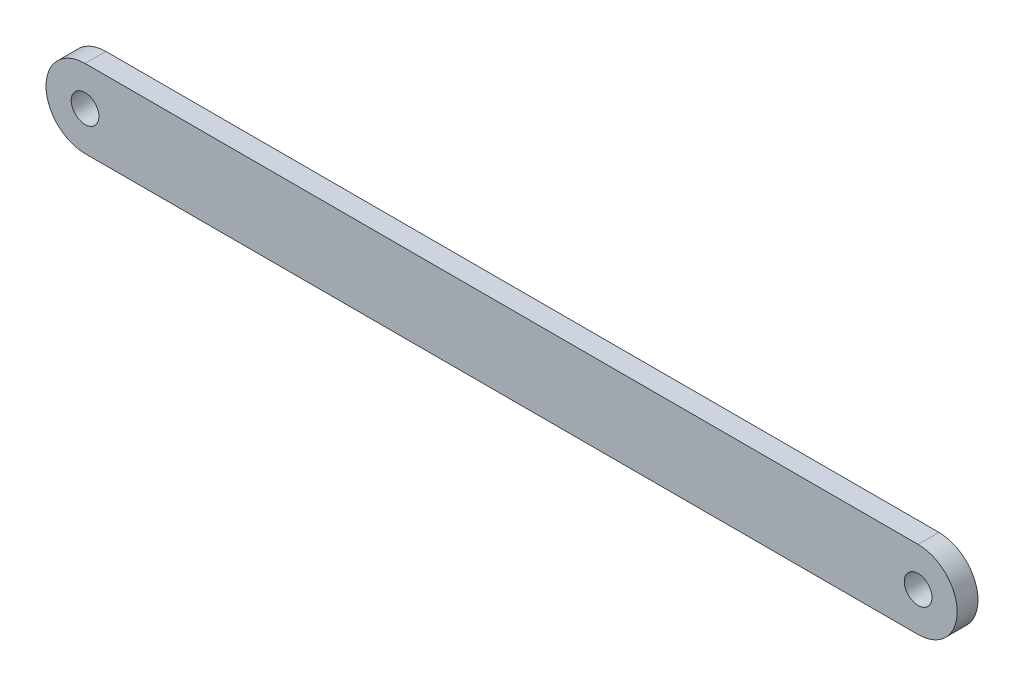
ISO-10303-21;
HEADER;
FILE_DESCRIPTION(('STEP AP214'),'2;1');
FILE_NAME('part.step','',(''),(''),'','','');
FILE_SCHEMA(('AUTOMOTIVE_DESIGN { 1 0 10303 214 1 1 1 1 }'));
ENDSEC;
DATA;
#1=APPLICATION_CONTEXT('core data for automotive mechanical design processes');
#2=APPLICATION_PROTOCOL_DEFINITION('international standard','automotive_design',2000,#1);
#3=PRODUCT_CONTEXT('',#1,'mechanical');
#4=PRODUCT('Part','Part','',(#3));
#5=PRODUCT_RELATED_PRODUCT_CATEGORY('part','',(#4));
#6=PRODUCT_DEFINITION_FORMATION('','',#4);
#7=PRODUCT_DEFINITION_CONTEXT('part definition',#1,'design');
#8=PRODUCT_DEFINITION('design','',#6,#7);
#9=PRODUCT_DEFINITION_SHAPE('','',#8);
#10=(LENGTH_UNIT() NAMED_UNIT(*) SI_UNIT(.MILLI.,.METRE.));
#11=(NAMED_UNIT(*) PLANE_ANGLE_UNIT() SI_UNIT($,.RADIAN.));
#12=(NAMED_UNIT(*) SI_UNIT($,.STERADIAN.) SOLID_ANGLE_UNIT());
#13=UNCERTAINTY_MEASURE_WITH_UNIT(LENGTH_MEASURE(1.E-05),#10,'distance_accuracy_value','');
#14=(GEOMETRIC_REPRESENTATION_CONTEXT(3) GLOBAL_UNCERTAINTY_ASSIGNED_CONTEXT((#13)) GLOBAL_UNIT_ASSIGNED_CONTEXT((#10,
#11,#12)) REPRESENTATION_CONTEXT('',''));
#15=CARTESIAN_POINT('',(0.,0.,0.));
#16=DIRECTION('',(0.,0.,1.));
#17=DIRECTION('',(1.,0.,0.));
#18=AXIS2_PLACEMENT_3D('',#15,#16,#17);
#19=CARTESIAN_POINT('',(-101.6,0.,5.08));
#20=DIRECTION('',(0.,0.,1.));
#21=DIRECTION('',(1.,0.,0.));
#22=AXIS2_PLACEMENT_3D('',#19,#20,#21);
#23=PLANE('',#22);
#24=CARTESIAN_POINT('',(-101.6,0.,5.08));
#25=DIRECTION('',(0.,0.,1.));
#26=DIRECTION('',(1.,0.,0.));
#27=AXIS2_PLACEMENT_3D('',#24,#25,#26);
#28=CIRCLE('',#27,3.37819999999999);
#29=CARTESIAN_POINT('',(-98.2218,0.,5.08));
#30=VERTEX_POINT('',#29);
#31=EDGE_CURVE('E103',#30,#30,#28,.T.);
#32=ORIENTED_EDGE('',*,*,#31,.F.);
#33=EDGE_LOOP('',(#32));
#34=FACE_BOUND('',#33,.T.);
#35=CARTESIAN_POINT('',(-101.6,0.,5.08));
#36=DIRECTION('',(0.,0.,1.));
#37=DIRECTION('',(1.,0.,0.));
#38=AXIS2_PLACEMENT_3D('',#35,#36,#37);
#39=CIRCLE('',#38,9.525);
#40=CARTESIAN_POINT('',(-101.6,9.525,5.08));
#41=VERTEX_POINT('',#40);
#42=CARTESIAN_POINT('',(-101.6,-9.525,5.08));
#43=VERTEX_POINT('',#42);
#44=EDGE_CURVE('E88',#41,#43,#39,.T.);
#45=ORIENTED_EDGE('',*,*,#44,.T.);
#46=DIRECTION('',(1.,0.,0.));
#47=VECTOR('',#46,1.);
#48=CARTESIAN_POINT('',(-101.6,-9.525,5.08));
#49=LINE('',#48,#47);
#50=CARTESIAN_POINT('',(101.6,-9.52499999999996,5.08));
#51=VERTEX_POINT('',#50);
#52=EDGE_CURVE('E83',#43,#51,#49,.T.);
#53=ORIENTED_EDGE('',*,*,#52,.T.);
#54=CARTESIAN_POINT('',(101.6,0.,5.08));
#55=DIRECTION('',(0.,0.,1.));
#56=DIRECTION('',(1.,0.,0.));
#57=AXIS2_PLACEMENT_3D('',#54,#55,#56);
#58=CIRCLE('',#57,9.525);
#59=CARTESIAN_POINT('',(101.6,9.52500000000004,5.08));
#60=VERTEX_POINT('',#59);
#61=EDGE_CURVE('E86',#51,#60,#58,.T.);
#62=ORIENTED_EDGE('',*,*,#61,.T.);
#63=DIRECTION('',(-1.,0.,0.));
#64=VECTOR('',#63,1.);
#65=CARTESIAN_POINT('',(-101.6,9.525,5.08));
#66=LINE('',#65,#64);
#67=EDGE_CURVE('E53',#60,#41,#66,.T.);
#68=ORIENTED_EDGE('',*,*,#67,.T.);
#69=EDGE_LOOP('',(#45,#53,#62,#68));
#70=FACE_BOUND('',#69,.T.);
#71=CARTESIAN_POINT('',(101.6,0.,5.08));
#72=DIRECTION('',(0.,0.,1.));
#73=DIRECTION('',(1.,0.,0.));
#74=AXIS2_PLACEMENT_3D('',#71,#72,#73);
#75=CIRCLE('',#74,3.37819999999999);
#76=CARTESIAN_POINT('',(104.9782,0.,5.08));
#77=VERTEX_POINT('',#76);
#78=EDGE_CURVE('E118',#77,#77,#75,.T.);
#79=ORIENTED_EDGE('',*,*,#78,.F.);
#80=EDGE_LOOP('',(#79));
#81=FACE_BOUND('',#80,.T.);
#82=ADVANCED_FACE('F36',(#34,#70,#81),#23,.T.);
#83=CARTESIAN_POINT('',(-101.6,0.,0.));
#84=DIRECTION('',(0.,0.,1.));
#85=DIRECTION('',(1.,0.,0.));
#86=AXIS2_PLACEMENT_3D('',#83,#84,#85);
#87=PLANE('',#86);
#88=CARTESIAN_POINT('',(-101.6,0.,0.));
#89=DIRECTION('',(0.,0.,1.));
#90=DIRECTION('',(1.,0.,0.));
#91=AXIS2_PLACEMENT_3D('',#88,#89,#90);
#92=CIRCLE('',#91,9.525);
#93=CARTESIAN_POINT('',(-101.6,9.525,0.));
#94=VERTEX_POINT('',#93);
#95=CARTESIAN_POINT('',(-101.6,-9.525,0.));
#96=VERTEX_POINT('',#95);
#97=EDGE_CURVE('E100',#94,#96,#92,.T.);
#98=ORIENTED_EDGE('',*,*,#97,.F.);
#99=DIRECTION('',(-1.,0.,0.));
#100=VECTOR('',#99,1.);
#101=CARTESIAN_POINT('',(-101.6,9.525,0.));
#102=LINE('',#101,#100);
#103=CARTESIAN_POINT('',(101.6,9.52500000000004,0.));
#104=VERTEX_POINT('',#103);
#105=EDGE_CURVE('E76',#104,#94,#102,.T.);
#106=ORIENTED_EDGE('',*,*,#105,.F.);
#107=CARTESIAN_POINT('',(101.6,0.,0.));
#108=DIRECTION('',(0.,0.,1.));
#109=DIRECTION('',(1.,0.,0.));
#110=AXIS2_PLACEMENT_3D('',#107,#108,#109);
#111=CIRCLE('',#110,9.525);
#112=CARTESIAN_POINT('',(101.6,-9.52499999999996,0.));
#113=VERTEX_POINT('',#112);
#114=EDGE_CURVE('E70',#113,#104,#111,.T.);
#115=ORIENTED_EDGE('',*,*,#114,.F.);
#116=DIRECTION('',(1.,0.,0.));
#117=VECTOR('',#116,1.);
#118=CARTESIAN_POINT('',(-101.6,-9.525,0.));
#119=LINE('',#118,#117);
#120=EDGE_CURVE('E92',#96,#113,#119,.T.);
#121=ORIENTED_EDGE('',*,*,#120,.F.);
#122=EDGE_LOOP('',(#98,#106,#115,#121));
#123=FACE_BOUND('',#122,.T.);
#124=CARTESIAN_POINT('',(-101.6,0.,0.));
#125=DIRECTION('',(0.,0.,1.));
#126=DIRECTION('',(1.,0.,0.));
#127=AXIS2_PLACEMENT_3D('',#124,#125,#126);
#128=CIRCLE('',#127,3.37819999999999);
#129=CARTESIAN_POINT('',(-98.2218,0.,0.));
#130=VERTEX_POINT('',#129);
#131=EDGE_CURVE('E115',#130,#130,#128,.T.);
#132=ORIENTED_EDGE('',*,*,#131,.T.);
#133=EDGE_LOOP('',(#132));
#134=FACE_BOUND('',#133,.T.);
#135=CARTESIAN_POINT('',(101.6,0.,0.));
#136=DIRECTION('',(0.,0.,1.));
#137=DIRECTION('',(1.,0.,0.));
#138=AXIS2_PLACEMENT_3D('',#135,#136,#137);
#139=CIRCLE('',#138,3.37819999999999);
#140=CARTESIAN_POINT('',(104.9782,0.,0.));
#141=VERTEX_POINT('',#140);
#142=EDGE_CURVE('E121',#141,#141,#139,.T.);
#143=ORIENTED_EDGE('',*,*,#142,.T.);
#144=EDGE_LOOP('',(#143));
#145=FACE_BOUND('',#144,.T.);
#146=ADVANCED_FACE('F111',(#123,#134,#145),#87,.F.);
#147=CARTESIAN_POINT('',(-101.6,0.,5.08));
#148=DIRECTION('',(0.,0.,-1.));
#149=DIRECTION('',(-1.,0.,0.));
#150=AXIS2_PLACEMENT_3D('',#147,#148,#149);
#151=CYLINDRICAL_SURFACE('',#150,9.525);
#152=ORIENTED_EDGE('',*,*,#97,.T.);
#153=DIRECTION('',(0.,0.,-1.));
#154=VECTOR('',#153,1.);
#155=CARTESIAN_POINT('',(-101.6,-9.525,5.08));
#156=LINE('',#155,#154);
#157=EDGE_CURVE('E11',#43,#96,#156,.T.);
#158=ORIENTED_EDGE('',*,*,#157,.F.);
#159=ORIENTED_EDGE('',*,*,#44,.F.);
#160=DIRECTION('',(0.,0.,-1.));
#161=VECTOR('',#160,1.);
#162=CARTESIAN_POINT('',(-101.6,9.525,5.08));
#163=LINE('',#162,#161);
#164=EDGE_CURVE('E96',#41,#94,#163,.T.);
#165=ORIENTED_EDGE('',*,*,#164,.T.);
#166=EDGE_LOOP('',(#152,#158,#159,#165));
#167=FACE_BOUND('',#166,.T.);
#168=ADVANCED_FACE('F38',(#167),#151,.T.);
#169=CARTESIAN_POINT('',(-101.6,-9.525,5.08));
#170=DIRECTION('',(0.,1.,0.));
#171=DIRECTION('',(-1.,0.,0.));
#172=AXIS2_PLACEMENT_3D('',#169,#170,#171);
#173=PLANE('',#172);
#174=ORIENTED_EDGE('',*,*,#120,.T.);
#175=DIRECTION('',(0.,0.,-1.));
#176=VECTOR('',#175,1.);
#177=CARTESIAN_POINT('',(101.6,-9.52499999999996,5.08));
#178=LINE('',#177,#176);
#179=EDGE_CURVE('E45',#51,#113,#178,.T.);
#180=ORIENTED_EDGE('',*,*,#179,.F.);
#181=ORIENTED_EDGE('',*,*,#52,.F.);
#182=ORIENTED_EDGE('',*,*,#157,.T.);
#183=EDGE_LOOP('',(#174,#180,#181,#182));
#184=FACE_BOUND('',#183,.T.);
#185=ADVANCED_FACE('F91',(#184),#173,.F.);
#186=CARTESIAN_POINT('',(101.6,0.,5.08));
#187=DIRECTION('',(0.,0.,-1.));
#188=DIRECTION('',(-1.,0.,0.));
#189=AXIS2_PLACEMENT_3D('',#186,#187,#188);
#190=CYLINDRICAL_SURFACE('',#189,9.525);
#191=ORIENTED_EDGE('',*,*,#114,.T.);
#192=DIRECTION('',(0.,0.,-1.));
#193=VECTOR('',#192,1.);
#194=CARTESIAN_POINT('',(101.6,9.52500000000004,5.08));
#195=LINE('',#194,#193);
#196=EDGE_CURVE('E93',#60,#104,#195,.T.);
#197=ORIENTED_EDGE('',*,*,#196,.F.);
#198=ORIENTED_EDGE('',*,*,#61,.F.);
#199=ORIENTED_EDGE('',*,*,#179,.T.);
#200=EDGE_LOOP('',(#191,#197,#198,#199));
#201=FACE_BOUND('',#200,.T.);
#202=ADVANCED_FACE('F94',(#201),#190,.T.);
#203=CARTESIAN_POINT('',(-101.6,9.525,5.08));
#204=DIRECTION('',(0.,-1.,0.));
#205=DIRECTION('',(1.,0.,0.));
#206=AXIS2_PLACEMENT_3D('',#203,#204,#205);
#207=PLANE('',#206);
#208=ORIENTED_EDGE('',*,*,#105,.T.);
#209=ORIENTED_EDGE('',*,*,#164,.F.);
#210=ORIENTED_EDGE('',*,*,#67,.F.);
#211=ORIENTED_EDGE('',*,*,#196,.T.);
#212=EDGE_LOOP('',(#208,#209,#210,#211));
#213=FACE_BOUND('',#212,.T.);
#214=ADVANCED_FACE('F108',(#213),#207,.F.);
#215=CARTESIAN_POINT('',(-101.6,0.,5.08));
#216=DIRECTION('',(0.,0.,-1.));
#217=DIRECTION('',(-1.,0.,0.));
#218=AXIS2_PLACEMENT_3D('',#215,#216,#217);
#219=CYLINDRICAL_SURFACE('',#218,3.37819999999999);
#220=ORIENTED_EDGE('',*,*,#31,.T.);
#221=EDGE_LOOP('',(#220));
#222=FACE_BOUND('',#221,.T.);
#223=ORIENTED_EDGE('',*,*,#131,.F.);
#224=EDGE_LOOP('',(#223));
#225=FACE_BOUND('',#224,.T.);
#226=ADVANCED_FACE('F138',(#222,#225),#219,.F.);
#227=CARTESIAN_POINT('',(101.6,0.,5.08));
#228=DIRECTION('',(0.,0.,-1.));
#229=DIRECTION('',(-1.,0.,0.));
#230=AXIS2_PLACEMENT_3D('',#227,#228,#229);
#231=CYLINDRICAL_SURFACE('',#230,3.37819999999999);
#232=ORIENTED_EDGE('',*,*,#78,.T.);
#233=EDGE_LOOP('',(#232));
#234=FACE_BOUND('',#233,.T.);
#235=ORIENTED_EDGE('',*,*,#142,.F.);
#236=EDGE_LOOP('',(#235));
#237=FACE_BOUND('',#236,.T.);
#238=ADVANCED_FACE('F127',(#234,#237),#231,.F.);
#239=CLOSED_SHELL('',(#82,#146,#168,#185,#202,#214,#226,#238));
#240=MANIFOLD_SOLID_BREP('B2',#239);
#241=ADVANCED_BREP_SHAPE_REPRESENTATION('',(#18,#240),#14);
#242=SHAPE_DEFINITION_REPRESENTATION(#9,#241);
ENDSEC;
END-ISO-10303-21;
